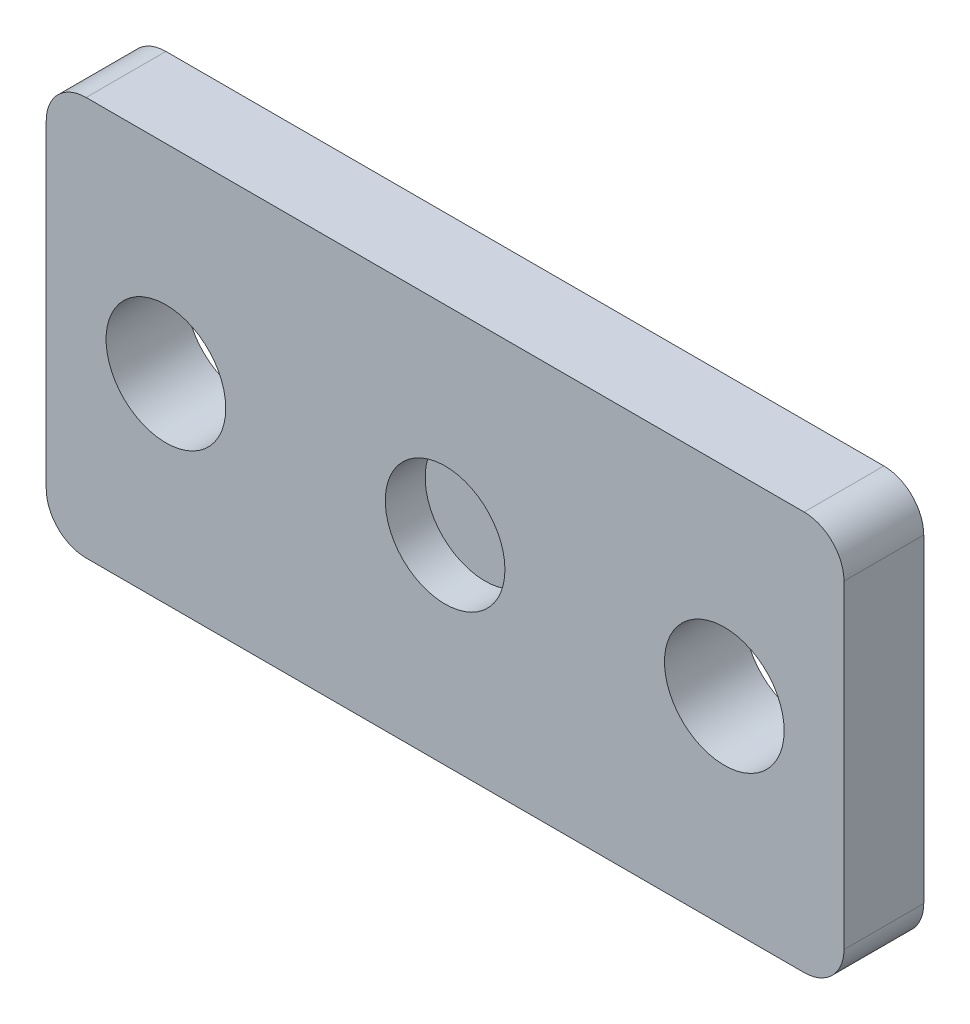
ISO-10303-21;
HEADER;
FILE_DESCRIPTION(('STEP AP214'),'2;1');
FILE_NAME('part.step','',(''),(''),'','','');
FILE_SCHEMA(('AUTOMOTIVE_DESIGN { 1 0 10303 214 1 1 1 1 }'));
ENDSEC;
DATA;
#1=APPLICATION_CONTEXT('core data for automotive mechanical design processes');
#2=APPLICATION_PROTOCOL_DEFINITION('international standard','automotive_design',2000,#1);
#3=PRODUCT_CONTEXT('',#1,'mechanical');
#4=PRODUCT('Part','Part','',(#3));
#5=PRODUCT_RELATED_PRODUCT_CATEGORY('part','',(#4));
#6=PRODUCT_DEFINITION_FORMATION('','',#4);
#7=PRODUCT_DEFINITION_CONTEXT('part definition',#1,'design');
#8=PRODUCT_DEFINITION('design','',#6,#7);
#9=PRODUCT_DEFINITION_SHAPE('','',#8);
#10=(LENGTH_UNIT() NAMED_UNIT(*) SI_UNIT(.MILLI.,.METRE.));
#11=(NAMED_UNIT(*) PLANE_ANGLE_UNIT() SI_UNIT($,.RADIAN.));
#12=(NAMED_UNIT(*) SI_UNIT($,.STERADIAN.) SOLID_ANGLE_UNIT());
#13=UNCERTAINTY_MEASURE_WITH_UNIT(LENGTH_MEASURE(1.E-05),#10,'distance_accuracy_value','');
#14=(GEOMETRIC_REPRESENTATION_CONTEXT(3) GLOBAL_UNCERTAINTY_ASSIGNED_CONTEXT((#13)) GLOBAL_UNIT_ASSIGNED_CONTEXT((#10,
#11,#12)) REPRESENTATION_CONTEXT('',''));
#15=CARTESIAN_POINT('',(0.,0.,0.));
#16=DIRECTION('',(0.,0.,1.));
#17=DIRECTION('',(1.,0.,0.));
#18=AXIS2_PLACEMENT_3D('',#15,#16,#17);
#19=CARTESIAN_POINT('',(0.,0.,0.));
#20=DIRECTION('',(0.,0.,-1.));
#21=DIRECTION('',(-1.,0.,0.));
#22=AXIS2_PLACEMENT_3D('',#19,#20,#21);
#23=PLANE('',#22);
#24=DIRECTION('',(1.,0.,0.));
#25=VECTOR('',#24,1.);
#26=CARTESIAN_POINT('',(-5000.,-2500.,0.));
#27=LINE('',#26,#25);
#28=CARTESIAN_POINT('',(-4500.,-2500.,0.));
#29=VERTEX_POINT('',#28);
#30=CARTESIAN_POINT('',(4500.,-2500.,0.));
#31=VERTEX_POINT('',#30);
#32=EDGE_CURVE('E197',#29,#31,#27,.T.);
#33=ORIENTED_EDGE('',*,*,#32,.F.);
#34=CARTESIAN_POINT('',(-4500.,-2000.,0.));
#35=DIRECTION('',(0.,0.,-1.));
#36=DIRECTION('',(-1.,0.,0.));
#37=AXIS2_PLACEMENT_3D('',#34,#35,#36);
#38=CIRCLE('',#37,500.);
#39=CARTESIAN_POINT('',(-5000.,-2000.,0.));
#40=VERTEX_POINT('',#39);
#41=EDGE_CURVE('E234',#29,#40,#38,.T.);
#42=ORIENTED_EDGE('',*,*,#41,.T.);
#43=DIRECTION('',(0.,-1.,0.));
#44=VECTOR('',#43,1.);
#45=CARTESIAN_POINT('',(-5000.,-2500.,0.));
#46=LINE('',#45,#44);
#47=CARTESIAN_POINT('',(-5000.,2000.,0.));
#48=VERTEX_POINT('',#47);
#49=EDGE_CURVE('E210',#48,#40,#46,.T.);
#50=ORIENTED_EDGE('',*,*,#49,.F.);
#51=CARTESIAN_POINT('',(-4500.,2000.,0.));
#52=DIRECTION('',(0.,0.,-1.));
#53=DIRECTION('',(-1.,0.,0.));
#54=AXIS2_PLACEMENT_3D('',#51,#52,#53);
#55=CIRCLE('',#54,500.);
#56=CARTESIAN_POINT('',(-4500.,2500.,0.));
#57=VERTEX_POINT('',#56);
#58=EDGE_CURVE('E217',#48,#57,#55,.T.);
#59=ORIENTED_EDGE('',*,*,#58,.T.);
#60=DIRECTION('',(-1.,0.,0.));
#61=VECTOR('',#60,1.);
#62=CARTESIAN_POINT('',(-5000.,2500.,0.));
#63=LINE('',#62,#61);
#64=CARTESIAN_POINT('',(4500.,2500.,0.));
#65=VERTEX_POINT('',#64);
#66=EDGE_CURVE('E208',#65,#57,#63,.T.);
#67=ORIENTED_EDGE('',*,*,#66,.F.);
#68=CARTESIAN_POINT('',(4500.,2000.,0.));
#69=DIRECTION('',(0.,0.,-1.));
#70=DIRECTION('',(-1.,0.,0.));
#71=AXIS2_PLACEMENT_3D('',#68,#69,#70);
#72=CIRCLE('',#71,500.);
#73=CARTESIAN_POINT('',(5000.,2000.,0.));
#74=VERTEX_POINT('',#73);
#75=EDGE_CURVE('E230',#65,#74,#72,.T.);
#76=ORIENTED_EDGE('',*,*,#75,.T.);
#77=DIRECTION('',(0.,1.,0.));
#78=VECTOR('',#77,1.);
#79=CARTESIAN_POINT('',(5000.,-2500.,0.));
#80=LINE('',#79,#78);
#81=CARTESIAN_POINT('',(5000.,-2000.,0.));
#82=VERTEX_POINT('',#81);
#83=EDGE_CURVE('E190',#82,#74,#80,.T.);
#84=ORIENTED_EDGE('',*,*,#83,.F.);
#85=CARTESIAN_POINT('',(4500.,-2000.,0.));
#86=DIRECTION('',(0.,0.,-1.));
#87=DIRECTION('',(-1.,0.,0.));
#88=AXIS2_PLACEMENT_3D('',#85,#86,#87);
#89=CIRCLE('',#88,500.);
#90=EDGE_CURVE('E232',#82,#31,#89,.T.);
#91=ORIENTED_EDGE('',*,*,#90,.T.);
#92=EDGE_LOOP('',(#33,#42,#50,#59,#67,#76,#84,#91));
#93=FACE_BOUND('',#92,.T.);
#94=CARTESIAN_POINT('',(-3500.,0.,0.));
#95=DIRECTION('',(0.,0.,1.));
#96=DIRECTION('',(1.,0.,0.));
#97=AXIS2_PLACEMENT_3D('',#94,#95,#96);
#98=CIRCLE('',#97,750.);
#99=CARTESIAN_POINT('',(-2750.,0.,0.));
#100=VERTEX_POINT('',#99);
#101=EDGE_CURVE('E187',#100,#100,#98,.T.);
#102=ORIENTED_EDGE('',*,*,#101,.T.);
#103=EDGE_LOOP('',(#102));
#104=FACE_BOUND('',#103,.T.);
#105=CARTESIAN_POINT('',(3500.,0.,0.));
#106=DIRECTION('',(0.,0.,1.));
#107=DIRECTION('',(1.,0.,0.));
#108=AXIS2_PLACEMENT_3D('',#105,#106,#107);
#109=CIRCLE('',#108,750.);
#110=CARTESIAN_POINT('',(4250.,0.,0.));
#111=VERTEX_POINT('',#110);
#112=EDGE_CURVE('E181',#111,#111,#109,.T.);
#113=ORIENTED_EDGE('',*,*,#112,.T.);
#114=EDGE_LOOP('',(#113));
#115=FACE_BOUND('',#114,.T.);
#116=DIRECTION('',(1.,0.,0.));
#117=VECTOR('',#116,1.);
#118=CARTESIAN_POINT('',(1000.,1000.,0.));
#119=LINE('',#118,#117);
#120=CARTESIAN_POINT('',(-1000.,1000.,0.));
#121=VERTEX_POINT('',#120);
#122=CARTESIAN_POINT('',(750.,1000.,0.));
#123=VERTEX_POINT('',#122);
#124=EDGE_CURVE('E154',#121,#123,#119,.T.);
#125=ORIENTED_EDGE('',*,*,#124,.F.);
#126=DIRECTION('',(0.,1.,0.));
#127=VECTOR('',#126,1.);
#128=CARTESIAN_POINT('',(-1000.,-1000.,0.));
#129=LINE('',#128,#127);
#130=CARTESIAN_POINT('',(-1000.,-750.,0.));
#131=VERTEX_POINT('',#130);
#132=EDGE_CURVE('E162',#131,#121,#129,.T.);
#133=ORIENTED_EDGE('',*,*,#132,.F.);
#134=CARTESIAN_POINT('',(-750.,-750.,0.));
#135=DIRECTION('',(0.,0.,-1.));
#136=DIRECTION('',(-1.,0.,0.));
#137=AXIS2_PLACEMENT_3D('',#134,#135,#136);
#138=CIRCLE('',#137,250.);
#139=CARTESIAN_POINT('',(-750.,-1000.,0.));
#140=VERTEX_POINT('',#139);
#141=EDGE_CURVE('E41',#131,#140,#138,.F.);
#142=ORIENTED_EDGE('',*,*,#141,.T.);
#143=DIRECTION('',(-1.,0.,0.));
#144=VECTOR('',#143,1.);
#145=CARTESIAN_POINT('',(1000.,-1000.,0.));
#146=LINE('',#145,#144);
#147=CARTESIAN_POINT('',(750.,-1000.,0.));
#148=VERTEX_POINT('',#147);
#149=EDGE_CURVE('E159',#148,#140,#146,.T.);
#150=ORIENTED_EDGE('',*,*,#149,.F.);
#151=CARTESIAN_POINT('',(750.,-750.,0.));
#152=DIRECTION('',(0.,0.,-1.));
#153=DIRECTION('',(-1.,0.,0.));
#154=AXIS2_PLACEMENT_3D('',#151,#152,#153);
#155=CIRCLE('',#154,250.);
#156=CARTESIAN_POINT('',(1000.,-750.,0.));
#157=VERTEX_POINT('',#156);
#158=EDGE_CURVE('E279',#148,#157,#155,.F.);
#159=ORIENTED_EDGE('',*,*,#158,.T.);
#160=DIRECTION('',(0.,-1.,0.));
#161=VECTOR('',#160,1.);
#162=CARTESIAN_POINT('',(1000.,-1000.,0.));
#163=LINE('',#162,#161);
#164=CARTESIAN_POINT('',(1000.,750.,0.));
#165=VERTEX_POINT('',#164);
#166=EDGE_CURVE('E168',#165,#157,#163,.T.);
#167=ORIENTED_EDGE('',*,*,#166,.F.);
#168=CARTESIAN_POINT('',(750.,750.,0.));
#169=DIRECTION('',(0.,0.,-1.));
#170=DIRECTION('',(-1.,0.,0.));
#171=AXIS2_PLACEMENT_3D('',#168,#169,#170);
#172=CIRCLE('',#171,250.);
#173=EDGE_CURVE('E11',#165,#123,#172,.F.);
#174=ORIENTED_EDGE('',*,*,#173,.T.);
#175=EDGE_LOOP('',(#125,#133,#142,#150,#159,#167,#174));
#176=FACE_BOUND('',#175,.T.);
#177=ADVANCED_FACE('F32',(#93,#104,#115,#176),#23,.T.);
#178=CARTESIAN_POINT('',(5000.,-2500.,1000.));
#179=DIRECTION('',(-1.,0.,0.));
#180=DIRECTION('',(0.,0.,1.));
#181=AXIS2_PLACEMENT_3D('',#178,#179,#180);
#182=PLANE('',#181);
#183=DIRECTION('',(0.,1.,0.));
#184=VECTOR('',#183,1.);
#185=CARTESIAN_POINT('',(5000.,-2500.,1000.));
#186=LINE('',#185,#184);
#187=CARTESIAN_POINT('',(5000.,-2000.,1000.));
#188=VERTEX_POINT('',#187);
#189=CARTESIAN_POINT('',(5000.,2000.,1000.));
#190=VERTEX_POINT('',#189);
#191=EDGE_CURVE('E193',#188,#190,#186,.T.);
#192=ORIENTED_EDGE('',*,*,#191,.F.);
#193=DIRECTION('',(0.,0.,-1.));
#194=VECTOR('',#193,1.);
#195=CARTESIAN_POINT('',(5000.,-2000.,1000.));
#196=LINE('',#195,#194);
#197=EDGE_CURVE('E246',#188,#82,#196,.T.);
#198=ORIENTED_EDGE('',*,*,#197,.T.);
#199=ORIENTED_EDGE('',*,*,#83,.T.);
#200=DIRECTION('',(0.,0.,-1.));
#201=VECTOR('',#200,1.);
#202=CARTESIAN_POINT('',(5000.,2000.,1000.));
#203=LINE('',#202,#201);
#204=EDGE_CURVE('E244',#74,#190,#203,.F.);
#205=ORIENTED_EDGE('',*,*,#204,.T.);
#206=EDGE_LOOP('',(#192,#198,#199,#205));
#207=FACE_BOUND('',#206,.T.);
#208=ADVANCED_FACE('F362',(#207),#182,.F.);
#209=CARTESIAN_POINT('',(-5000.,2500.,1000.));
#210=DIRECTION('',(0.,-1.,0.));
#211=DIRECTION('',(0.,0.,-1.));
#212=AXIS2_PLACEMENT_3D('',#209,#210,#211);
#213=PLANE('',#212);
#214=DIRECTION('',(-1.,0.,0.));
#215=VECTOR('',#214,1.);
#216=CARTESIAN_POINT('',(-5000.,2500.,1000.));
#217=LINE('',#216,#215);
#218=CARTESIAN_POINT('',(4500.,2500.,1000.));
#219=VERTEX_POINT('',#218);
#220=CARTESIAN_POINT('',(-4500.,2500.,1000.));
#221=VERTEX_POINT('',#220);
#222=EDGE_CURVE('E196',#219,#221,#217,.T.);
#223=ORIENTED_EDGE('',*,*,#222,.F.);
#224=DIRECTION('',(0.,0.,-1.));
#225=VECTOR('',#224,1.);
#226=CARTESIAN_POINT('',(4500.,2500.,1000.));
#227=LINE('',#226,#225);
#228=EDGE_CURVE('E249',#219,#65,#227,.T.);
#229=ORIENTED_EDGE('',*,*,#228,.T.);
#230=ORIENTED_EDGE('',*,*,#66,.T.);
#231=DIRECTION('',(0.,0.,-1.));
#232=VECTOR('',#231,1.);
#233=CARTESIAN_POINT('',(-4500.,2500.,1000.));
#234=LINE('',#233,#232);
#235=EDGE_CURVE('E220',#57,#221,#234,.F.);
#236=ORIENTED_EDGE('',*,*,#235,.T.);
#237=EDGE_LOOP('',(#223,#229,#230,#236));
#238=FACE_BOUND('',#237,.T.);
#239=ADVANCED_FACE('F368',(#238),#213,.F.);
#240=CARTESIAN_POINT('',(-5000.,-2500.,1000.));
#241=DIRECTION('',(1.,0.,0.));
#242=DIRECTION('',(0.,0.,-1.));
#243=AXIS2_PLACEMENT_3D('',#240,#241,#242);
#244=PLANE('',#243);
#245=ORIENTED_EDGE('',*,*,#49,.T.);
#246=DIRECTION('',(0.,0.,-1.));
#247=VECTOR('',#246,1.);
#248=CARTESIAN_POINT('',(-5000.,-2000.,1000.));
#249=LINE('',#248,#247);
#250=CARTESIAN_POINT('',(-5000.,-2000.,1000.));
#251=VERTEX_POINT('',#250);
#252=EDGE_CURVE('E236',#40,#251,#249,.F.);
#253=ORIENTED_EDGE('',*,*,#252,.T.);
#254=DIRECTION('',(0.,-1.,0.));
#255=VECTOR('',#254,1.);
#256=CARTESIAN_POINT('',(-5000.,-2500.,1000.));
#257=LINE('',#256,#255);
#258=CARTESIAN_POINT('',(-5000.,2000.,1000.));
#259=VERTEX_POINT('',#258);
#260=EDGE_CURVE('E199',#259,#251,#257,.T.);
#261=ORIENTED_EDGE('',*,*,#260,.F.);
#262=DIRECTION('',(0.,0.,-1.));
#263=VECTOR('',#262,1.);
#264=CARTESIAN_POINT('',(-5000.,2000.,1000.));
#265=LINE('',#264,#263);
#266=EDGE_CURVE('E205',#259,#48,#265,.T.);
#267=ORIENTED_EDGE('',*,*,#266,.T.);
#268=EDGE_LOOP('',(#245,#253,#261,#267));
#269=FACE_BOUND('',#268,.T.);
#270=ADVANCED_FACE('F380',(#269),#244,.F.);
#271=CARTESIAN_POINT('',(-5000.,-2500.,1000.));
#272=DIRECTION('',(0.,1.,0.));
#273=DIRECTION('',(0.,0.,1.));
#274=AXIS2_PLACEMENT_3D('',#271,#272,#273);
#275=PLANE('',#274);
#276=DIRECTION('',(1.,0.,0.));
#277=VECTOR('',#276,1.);
#278=CARTESIAN_POINT('',(-5000.,-2500.,1000.));
#279=LINE('',#278,#277);
#280=CARTESIAN_POINT('',(-4500.,-2500.,1000.));
#281=VERTEX_POINT('',#280);
#282=CARTESIAN_POINT('',(4500.,-2500.,1000.));
#283=VERTEX_POINT('',#282);
#284=EDGE_CURVE('E202',#281,#283,#279,.T.);
#285=ORIENTED_EDGE('',*,*,#284,.F.);
#286=DIRECTION('',(0.,0.,-1.));
#287=VECTOR('',#286,1.);
#288=CARTESIAN_POINT('',(-4500.,-2500.,1000.));
#289=LINE('',#288,#287);
#290=EDGE_CURVE('E227',#281,#29,#289,.T.);
#291=ORIENTED_EDGE('',*,*,#290,.T.);
#292=ORIENTED_EDGE('',*,*,#32,.T.);
#293=DIRECTION('',(0.,0.,-1.));
#294=VECTOR('',#293,1.);
#295=CARTESIAN_POINT('',(4500.,-2500.,1000.));
#296=LINE('',#295,#294);
#297=EDGE_CURVE('E225',#31,#283,#296,.F.);
#298=ORIENTED_EDGE('',*,*,#297,.T.);
#299=EDGE_LOOP('',(#285,#291,#292,#298));
#300=FACE_BOUND('',#299,.T.);
#301=ADVANCED_FACE('F377',(#300),#275,.F.);
#302=CARTESIAN_POINT('',(0.,0.,1000.));
#303=DIRECTION('',(0.,0.,-1.));
#304=DIRECTION('',(-1.,0.,0.));
#305=AXIS2_PLACEMENT_3D('',#302,#303,#304);
#306=PLANE('',#305);
#307=CARTESIAN_POINT('',(0.,0.,1000.));
#308=DIRECTION('',(0.,0.,1.));
#309=DIRECTION('',(1.,0.,0.));
#310=AXIS2_PLACEMENT_3D('',#307,#308,#309);
#311=CIRCLE('',#310,750.);
#312=CARTESIAN_POINT('',(750.,0.,1000.));
#313=VERTEX_POINT('',#312);
#314=EDGE_CURVE('E158',#313,#313,#311,.T.);
#315=ORIENTED_EDGE('',*,*,#314,.F.);
#316=EDGE_LOOP('',(#315));
#317=FACE_BOUND('',#316,.T.);
#318=CARTESIAN_POINT('',(3500.,0.,1000.));
#319=DIRECTION('',(0.,0.,1.));
#320=DIRECTION('',(1.,0.,0.));
#321=AXIS2_PLACEMENT_3D('',#318,#319,#320);
#322=CIRCLE('',#321,750.);
#323=CARTESIAN_POINT('',(4250.,0.,1000.));
#324=VERTEX_POINT('',#323);
#325=EDGE_CURVE('E178',#324,#324,#322,.T.);
#326=ORIENTED_EDGE('',*,*,#325,.F.);
#327=EDGE_LOOP('',(#326));
#328=FACE_BOUND('',#327,.T.);
#329=CARTESIAN_POINT('',(-3500.,0.,1000.));
#330=DIRECTION('',(0.,0.,1.));
#331=DIRECTION('',(1.,0.,0.));
#332=AXIS2_PLACEMENT_3D('',#329,#330,#331);
#333=CIRCLE('',#332,750.);
#334=CARTESIAN_POINT('',(-2750.,0.,1000.));
#335=VERTEX_POINT('',#334);
#336=EDGE_CURVE('E184',#335,#335,#333,.T.);
#337=ORIENTED_EDGE('',*,*,#336,.F.);
#338=EDGE_LOOP('',(#337));
#339=FACE_BOUND('',#338,.T.);
#340=ORIENTED_EDGE('',*,*,#260,.T.);
#341=CARTESIAN_POINT('',(-4500.,-2000.,1000.));
#342=DIRECTION('',(0.,0.,-1.));
#343=DIRECTION('',(-1.,0.,0.));
#344=AXIS2_PLACEMENT_3D('',#341,#342,#343);
#345=CIRCLE('',#344,500.);
#346=EDGE_CURVE('E242',#251,#281,#345,.F.);
#347=ORIENTED_EDGE('',*,*,#346,.T.);
#348=ORIENTED_EDGE('',*,*,#284,.T.);
#349=CARTESIAN_POINT('',(4500.,-2000.,1000.));
#350=DIRECTION('',(0.,0.,-1.));
#351=DIRECTION('',(-1.,0.,0.));
#352=AXIS2_PLACEMENT_3D('',#349,#350,#351);
#353=CIRCLE('',#352,500.);
#354=EDGE_CURVE('E240',#283,#188,#353,.F.);
#355=ORIENTED_EDGE('',*,*,#354,.T.);
#356=ORIENTED_EDGE('',*,*,#191,.T.);
#357=CARTESIAN_POINT('',(4500.,2000.,1000.));
#358=DIRECTION('',(0.,0.,-1.));
#359=DIRECTION('',(-1.,0.,0.));
#360=AXIS2_PLACEMENT_3D('',#357,#358,#359);
#361=CIRCLE('',#360,500.);
#362=EDGE_CURVE('E238',#190,#219,#361,.F.);
#363=ORIENTED_EDGE('',*,*,#362,.T.);
#364=ORIENTED_EDGE('',*,*,#222,.T.);
#365=CARTESIAN_POINT('',(-4500.,2000.,1000.));
#366=DIRECTION('',(0.,0.,-1.));
#367=DIRECTION('',(-1.,0.,0.));
#368=AXIS2_PLACEMENT_3D('',#365,#366,#367);
#369=CIRCLE('',#368,500.);
#370=EDGE_CURVE('E223',#221,#259,#369,.F.);
#371=ORIENTED_EDGE('',*,*,#370,.T.);
#372=EDGE_LOOP('',(#340,#347,#348,#355,#356,#363,#364,#371));
#373=FACE_BOUND('',#372,.T.);
#374=ADVANCED_FACE('F375',(#317,#328,#339,#373),#306,.F.);
#375=CARTESIAN_POINT('',(-4500.,2000.,1000.));
#376=DIRECTION('',(0.,0.,-1.));
#377=DIRECTION('',(-1.,0.,0.));
#378=AXIS2_PLACEMENT_3D('',#375,#376,#377);
#379=CYLINDRICAL_SURFACE('',#378,500.);
#380=ORIENTED_EDGE('',*,*,#370,.F.);
#381=ORIENTED_EDGE('',*,*,#235,.F.);
#382=ORIENTED_EDGE('',*,*,#58,.F.);
#383=ORIENTED_EDGE('',*,*,#266,.F.);
#384=EDGE_LOOP('',(#380,#381,#382,#383));
#385=FACE_BOUND('',#384,.T.);
#386=ADVANCED_FACE('F388',(#385),#379,.T.);
#387=CARTESIAN_POINT('',(-4500.,-2000.,1000.));
#388=DIRECTION('',(0.,0.,-1.));
#389=DIRECTION('',(-1.,0.,0.));
#390=AXIS2_PLACEMENT_3D('',#387,#388,#389);
#391=CYLINDRICAL_SURFACE('',#390,500.);
#392=ORIENTED_EDGE('',*,*,#346,.F.);
#393=ORIENTED_EDGE('',*,*,#252,.F.);
#394=ORIENTED_EDGE('',*,*,#41,.F.);
#395=ORIENTED_EDGE('',*,*,#290,.F.);
#396=EDGE_LOOP('',(#392,#393,#394,#395));
#397=FACE_BOUND('',#396,.T.);
#398=ADVANCED_FACE('F391',(#397),#391,.T.);
#399=CARTESIAN_POINT('',(4500.,-2000.,1000.));
#400=DIRECTION('',(0.,0.,-1.));
#401=DIRECTION('',(-1.,0.,0.));
#402=AXIS2_PLACEMENT_3D('',#399,#400,#401);
#403=CYLINDRICAL_SURFACE('',#402,500.);
#404=ORIENTED_EDGE('',*,*,#354,.F.);
#405=ORIENTED_EDGE('',*,*,#297,.F.);
#406=ORIENTED_EDGE('',*,*,#90,.F.);
#407=ORIENTED_EDGE('',*,*,#197,.F.);
#408=EDGE_LOOP('',(#404,#405,#406,#407));
#409=FACE_BOUND('',#408,.T.);
#410=ADVANCED_FACE('F395',(#409),#403,.T.);
#411=CARTESIAN_POINT('',(4500.,2000.,1000.));
#412=DIRECTION('',(0.,0.,-1.));
#413=DIRECTION('',(-1.,0.,0.));
#414=AXIS2_PLACEMENT_3D('',#411,#412,#413);
#415=CYLINDRICAL_SURFACE('',#414,500.);
#416=ORIENTED_EDGE('',*,*,#362,.F.);
#417=ORIENTED_EDGE('',*,*,#204,.F.);
#418=ORIENTED_EDGE('',*,*,#75,.F.);
#419=ORIENTED_EDGE('',*,*,#228,.F.);
#420=EDGE_LOOP('',(#416,#417,#418,#419));
#421=FACE_BOUND('',#420,.T.);
#422=ADVANCED_FACE('F399',(#421),#415,.T.);
#423=CARTESIAN_POINT('',(-3500.,0.,0.));
#424=DIRECTION('',(0.,0.,1.));
#425=DIRECTION('',(1.,0.,0.));
#426=AXIS2_PLACEMENT_3D('',#423,#424,#425);
#427=CYLINDRICAL_SURFACE('',#426,750.);
#428=ORIENTED_EDGE('',*,*,#101,.F.);
#429=EDGE_LOOP('',(#428));
#430=FACE_BOUND('',#429,.T.);
#431=ORIENTED_EDGE('',*,*,#336,.T.);
#432=EDGE_LOOP('',(#431));
#433=FACE_BOUND('',#432,.T.);
#434=ADVANCED_FACE('F402',(#430,#433),#427,.F.);
#435=CARTESIAN_POINT('',(3500.,0.,0.));
#436=DIRECTION('',(0.,0.,1.));
#437=DIRECTION('',(1.,0.,0.));
#438=AXIS2_PLACEMENT_3D('',#435,#436,#437);
#439=CYLINDRICAL_SURFACE('',#438,750.);
#440=ORIENTED_EDGE('',*,*,#112,.F.);
#441=EDGE_LOOP('',(#440));
#442=FACE_BOUND('',#441,.T.);
#443=ORIENTED_EDGE('',*,*,#325,.T.);
#444=EDGE_LOOP('',(#443));
#445=FACE_BOUND('',#444,.T.);
#446=ADVANCED_FACE('F407',(#442,#445),#439,.F.);
#447=CARTESIAN_POINT('',(0.,0.,500.));
#448=DIRECTION('',(0.,0.,1.));
#449=DIRECTION('',(1.,0.,0.));
#450=AXIS2_PLACEMENT_3D('',#447,#448,#449);
#451=CYLINDRICAL_SURFACE('',#450,750.);
#452=CARTESIAN_POINT('',(0.,0.,500.));
#453=DIRECTION('',(0.,0.,1.));
#454=DIRECTION('',(1.,0.,0.));
#455=AXIS2_PLACEMENT_3D('',#452,#453,#454);
#456=CIRCLE('',#455,750.);
#457=CARTESIAN_POINT('',(750.,0.,500.));
#458=VERTEX_POINT('',#457);
#459=EDGE_CURVE('E175',#458,#458,#456,.T.);
#460=ORIENTED_EDGE('',*,*,#459,.F.);
#461=EDGE_LOOP('',(#460));
#462=FACE_BOUND('',#461,.T.);
#463=ORIENTED_EDGE('',*,*,#314,.T.);
#464=EDGE_LOOP('',(#463));
#465=FACE_BOUND('',#464,.T.);
#466=ADVANCED_FACE('F441',(#462,#465),#451,.F.);
#467=CARTESIAN_POINT('',(0.,0.,500.));
#468=DIRECTION('',(0.,0.,1.));
#469=DIRECTION('',(1.,0.,0.));
#470=AXIS2_PLACEMENT_3D('',#467,#468,#469);
#471=PLANE('',#470);
#472=ORIENTED_EDGE('',*,*,#459,.T.);
#473=EDGE_LOOP('',(#472));
#474=FACE_BOUND('',#473,.T.);
#475=ADVANCED_FACE('F447',(#474),#471,.T.);
#476=CARTESIAN_POINT('',(-1000.,-1000.,-500.));
#477=DIRECTION('',(1.,0.,0.));
#478=DIRECTION('',(0.,1.,0.));
#479=AXIS2_PLACEMENT_3D('',#476,#477,#478);
#480=PLANE('',#479);
#481=DIRECTION('',(0.,1.,0.));
#482=VECTOR('',#481,1.);
#483=CARTESIAN_POINT('',(-1000.,-1000.,-250.));
#484=LINE('',#483,#482);
#485=CARTESIAN_POINT('',(-1000.,1000.,-250.));
#486=VERTEX_POINT('',#485);
#487=CARTESIAN_POINT('',(-1000.,-750.,-250.));
#488=VERTEX_POINT('',#487);
#489=EDGE_CURVE('E274',#486,#488,#484,.F.);
#490=ORIENTED_EDGE('',*,*,#489,.T.);
#491=DIRECTION('',(0.,0.,1.));
#492=VECTOR('',#491,1.);
#493=CARTESIAN_POINT('',(-1000.,-750.,-500.));
#494=LINE('',#493,#492);
#495=EDGE_CURVE('E165',#488,#131,#494,.T.);
#496=ORIENTED_EDGE('',*,*,#495,.T.);
#497=ORIENTED_EDGE('',*,*,#132,.T.);
#498=DIRECTION('',(0.,0.,1.));
#499=VECTOR('',#498,1.);
#500=CARTESIAN_POINT('',(-1000.,1000.,-500.));
#501=LINE('',#500,#499);
#502=EDGE_CURVE('E151',#486,#121,#501,.T.);
#503=ORIENTED_EDGE('',*,*,#502,.F.);
#504=EDGE_LOOP('',(#490,#496,#497,#503));
#505=FACE_BOUND('',#504,.T.);
#506=ADVANCED_FACE('F163',(#505),#480,.F.);
#507=CARTESIAN_POINT('',(1000.,1000.,-500.));
#508=DIRECTION('',(0.,-1.,0.));
#509=DIRECTION('',(0.,0.,-1.));
#510=AXIS2_PLACEMENT_3D('',#507,#508,#509);
#511=PLANE('',#510);
#512=DIRECTION('',(0.,0.,1.));
#513=VECTOR('',#512,1.);
#514=CARTESIAN_POINT('',(750.,1000.,-500.));
#515=LINE('',#514,#513);
#516=CARTESIAN_POINT('',(750.,1000.,-250.));
#517=VERTEX_POINT('',#516);
#518=EDGE_CURVE('E49',#123,#517,#515,.F.);
#519=ORIENTED_EDGE('',*,*,#518,.T.);
#520=DIRECTION('',(1.,0.,0.));
#521=VECTOR('',#520,1.);
#522=CARTESIAN_POINT('',(1000.,1000.,-250.));
#523=LINE('',#522,#521);
#524=EDGE_CURVE('E155',#517,#486,#523,.F.);
#525=ORIENTED_EDGE('',*,*,#524,.T.);
#526=ORIENTED_EDGE('',*,*,#502,.T.);
#527=ORIENTED_EDGE('',*,*,#124,.T.);
#528=EDGE_LOOP('',(#519,#525,#526,#527));
#529=FACE_BOUND('',#528,.T.);
#530=ADVANCED_FACE('F153',(#529),#511,.F.);
#531=CARTESIAN_POINT('',(1000.,-1000.,-500.));
#532=DIRECTION('',(-1.,0.,0.));
#533=DIRECTION('',(0.,0.,1.));
#534=AXIS2_PLACEMENT_3D('',#531,#532,#533);
#535=PLANE('',#534);
#536=ORIENTED_EDGE('',*,*,#166,.T.);
#537=DIRECTION('',(0.,0.,1.));
#538=VECTOR('',#537,1.);
#539=CARTESIAN_POINT('',(1000.,-750.,-500.));
#540=LINE('',#539,#538);
#541=CARTESIAN_POINT('',(1000.,-750.,-250.));
#542=VERTEX_POINT('',#541);
#543=EDGE_CURVE('E263',#157,#542,#540,.F.);
#544=ORIENTED_EDGE('',*,*,#543,.T.);
#545=DIRECTION('',(0.,-1.,0.));
#546=VECTOR('',#545,1.);
#547=CARTESIAN_POINT('',(1000.,-1000.,-250.));
#548=LINE('',#547,#546);
#549=CARTESIAN_POINT('',(1000.,750.,-250.));
#550=VERTEX_POINT('',#549);
#551=EDGE_CURVE('E261',#542,#550,#548,.F.);
#552=ORIENTED_EDGE('',*,*,#551,.T.);
#553=DIRECTION('',(0.,0.,1.));
#554=VECTOR('',#553,1.);
#555=CARTESIAN_POINT('',(1000.,750.,-500.));
#556=LINE('',#555,#554);
#557=EDGE_CURVE('E259',#550,#165,#556,.T.);
#558=ORIENTED_EDGE('',*,*,#557,.T.);
#559=EDGE_LOOP('',(#536,#544,#552,#558));
#560=FACE_BOUND('',#559,.T.);
#561=ADVANCED_FACE('F343',(#560),#535,.F.);
#562=CARTESIAN_POINT('',(1000.,-1000.,-500.));
#563=DIRECTION('',(0.,1.,0.));
#564=DIRECTION('',(0.,0.,1.));
#565=AXIS2_PLACEMENT_3D('',#562,#563,#564);
#566=PLANE('',#565);
#567=DIRECTION('',(-1.,0.,0.));
#568=VECTOR('',#567,1.);
#569=CARTESIAN_POINT('',(1000.,-1000.,-250.));
#570=LINE('',#569,#568);
#571=CARTESIAN_POINT('',(-750.,-1000.,-250.));
#572=VERTEX_POINT('',#571);
#573=CARTESIAN_POINT('',(750.,-1000.,-250.));
#574=VERTEX_POINT('',#573);
#575=EDGE_CURVE('E252',#572,#574,#570,.F.);
#576=ORIENTED_EDGE('',*,*,#575,.T.);
#577=DIRECTION('',(0.,0.,1.));
#578=VECTOR('',#577,1.);
#579=CARTESIAN_POINT('',(750.,-1000.,-500.));
#580=LINE('',#579,#578);
#581=EDGE_CURVE('E256',#574,#148,#580,.T.);
#582=ORIENTED_EDGE('',*,*,#581,.T.);
#583=ORIENTED_EDGE('',*,*,#149,.T.);
#584=DIRECTION('',(0.,0.,1.));
#585=VECTOR('',#584,1.);
#586=CARTESIAN_POINT('',(-750.,-1000.,-500.));
#587=LINE('',#586,#585);
#588=EDGE_CURVE('E254',#140,#572,#587,.F.);
#589=ORIENTED_EDGE('',*,*,#588,.T.);
#590=EDGE_LOOP('',(#576,#582,#583,#589));
#591=FACE_BOUND('',#590,.T.);
#592=ADVANCED_FACE('F337',(#591),#566,.F.);
#593=CARTESIAN_POINT('',(0.,0.,-500.));
#594=DIRECTION('',(0.,0.,1.));
#595=DIRECTION('',(1.,0.,0.));
#596=AXIS2_PLACEMENT_3D('',#593,#594,#595);
#597=PLANE('',#596);
#598=DIRECTION('',(1.,0.,0.));
#599=VECTOR('',#598,1.);
#600=CARTESIAN_POINT('',(0.,750.,-500.));
#601=LINE('',#600,#599);
#602=CARTESIAN_POINT('',(-750.,750.,-500.));
#603=VERTEX_POINT('',#602);
#604=CARTESIAN_POINT('',(750.,750.,-500.));
#605=VERTEX_POINT('',#604);
#606=EDGE_CURVE('E265',#603,#605,#601,.T.);
#607=ORIENTED_EDGE('',*,*,#606,.T.);
#608=DIRECTION('',(0.,-1.,0.));
#609=VECTOR('',#608,1.);
#610=CARTESIAN_POINT('',(750.,0.,-500.));
#611=LINE('',#610,#609);
#612=CARTESIAN_POINT('',(750.,-750.,-500.));
#613=VERTEX_POINT('',#612);
#614=EDGE_CURVE('E271',#605,#613,#611,.T.);
#615=ORIENTED_EDGE('',*,*,#614,.T.);
#616=DIRECTION('',(-1.,0.,0.));
#617=VECTOR('',#616,1.);
#618=CARTESIAN_POINT('',(0.,-750.,-500.));
#619=LINE('',#618,#617);
#620=CARTESIAN_POINT('',(-750.,-750.,-500.));
#621=VERTEX_POINT('',#620);
#622=EDGE_CURVE('E269',#613,#621,#619,.T.);
#623=ORIENTED_EDGE('',*,*,#622,.T.);
#624=DIRECTION('',(0.,1.,0.));
#625=VECTOR('',#624,1.);
#626=CARTESIAN_POINT('',(-750.,0.,-500.));
#627=LINE('',#626,#625);
#628=EDGE_CURVE('E267',#621,#603,#627,.T.);
#629=ORIENTED_EDGE('',*,*,#628,.T.);
#630=EDGE_LOOP('',(#607,#615,#623,#629));
#631=FACE_BOUND('',#630,.T.);
#632=ADVANCED_FACE('F320',(#631),#597,.F.);
#633=CARTESIAN_POINT('',(750.,750.,-500.));
#634=DIRECTION('',(0.,0.,1.));
#635=DIRECTION('',(1.,0.,0.));
#636=AXIS2_PLACEMENT_3D('',#633,#634,#635);
#637=CYLINDRICAL_SURFACE('',#636,250.);
#638=ORIENTED_EDGE('',*,*,#173,.F.);
#639=ORIENTED_EDGE('',*,*,#557,.F.);
#640=CARTESIAN_POINT('',(750.,750.,-250.));
#641=DIRECTION('',(0.,0.,-1.));
#642=DIRECTION('',(-1.,0.,0.));
#643=AXIS2_PLACEMENT_3D('',#640,#641,#642);
#644=CIRCLE('',#643,250.);
#645=EDGE_CURVE('E304',#517,#550,#644,.T.);
#646=ORIENTED_EDGE('',*,*,#645,.F.);
#647=ORIENTED_EDGE('',*,*,#518,.F.);
#648=EDGE_LOOP('',(#638,#639,#646,#647));
#649=FACE_BOUND('',#648,.T.);
#650=ADVANCED_FACE('F34',(#649),#637,.T.);
#651=CARTESIAN_POINT('',(0.,750.,-250.));
#652=DIRECTION('',(1.,0.,0.));
#653=DIRECTION('',(0.,0.,-1.));
#654=AXIS2_PLACEMENT_3D('',#651,#652,#653);
#655=CYLINDRICAL_SURFACE('',#654,250.);
#656=CARTESIAN_POINT('',(750.,750.,-250.));
#657=DIRECTION('',(1.,0.,0.));
#658=DIRECTION('',(0.,0.,-1.));
#659=AXIS2_PLACEMENT_3D('',#656,#657,#658);
#660=CIRCLE('',#659,250.);
#661=EDGE_CURVE('E302',#605,#517,#660,.T.);
#662=ORIENTED_EDGE('',*,*,#661,.F.);
#663=ORIENTED_EDGE('',*,*,#606,.F.);
#664=CARTESIAN_POINT('',(-750.,750.,-250.));
#665=DIRECTION('',(0.707106781186547,0.707106781186548,0.));
#666=DIRECTION('',(0.707106781186547,-0.707106781186547,0.));
#667=AXIS2_PLACEMENT_3D('',#664,#665,#666);
#668=ELLIPSE('',#667,353.553390593274,250.);
#669=EDGE_CURVE('E36',#486,#603,#668,.F.);
#670=ORIENTED_EDGE('',*,*,#669,.F.);
#671=ORIENTED_EDGE('',*,*,#524,.F.);
#672=EDGE_LOOP('',(#662,#663,#670,#671));
#673=FACE_BOUND('',#672,.T.);
#674=ADVANCED_FACE('F318',(#673),#655,.T.);
#675=CARTESIAN_POINT('',(-750.,0.,-250.));
#676=DIRECTION('',(0.,1.,0.));
#677=DIRECTION('',(-1.,0.,0.));
#678=AXIS2_PLACEMENT_3D('',#675,#676,#677);
#679=CYLINDRICAL_SURFACE('',#678,250.);
#680=ORIENTED_EDGE('',*,*,#669,.T.);
#681=ORIENTED_EDGE('',*,*,#628,.F.);
#682=CARTESIAN_POINT('',(-750.,-750.,-250.));
#683=DIRECTION('',(0.,-1.,0.));
#684=DIRECTION('',(0.,0.,-1.));
#685=AXIS2_PLACEMENT_3D('',#682,#683,#684);
#686=CIRCLE('',#685,250.);
#687=EDGE_CURVE('E299',#488,#621,#686,.T.);
#688=ORIENTED_EDGE('',*,*,#687,.F.);
#689=ORIENTED_EDGE('',*,*,#489,.F.);
#690=EDGE_LOOP('',(#680,#681,#688,#689));
#691=FACE_BOUND('',#690,.T.);
#692=ADVANCED_FACE('F313',(#691),#679,.T.);
#693=CARTESIAN_POINT('',(-750.,-750.,-500.));
#694=DIRECTION('',(0.,0.,1.));
#695=DIRECTION('',(1.,0.,0.));
#696=AXIS2_PLACEMENT_3D('',#693,#694,#695);
#697=CYLINDRICAL_SURFACE('',#696,250.);
#698=ORIENTED_EDGE('',*,*,#141,.F.);
#699=ORIENTED_EDGE('',*,*,#495,.F.);
#700=CARTESIAN_POINT('',(-750.,-750.,-250.));
#701=DIRECTION('',(0.,0.,-1.));
#702=DIRECTION('',(-1.,0.,0.));
#703=AXIS2_PLACEMENT_3D('',#700,#701,#702);
#704=CIRCLE('',#703,250.);
#705=EDGE_CURVE('E296',#572,#488,#704,.T.);
#706=ORIENTED_EDGE('',*,*,#705,.F.);
#707=ORIENTED_EDGE('',*,*,#588,.F.);
#708=EDGE_LOOP('',(#698,#699,#706,#707));
#709=FACE_BOUND('',#708,.T.);
#710=ADVANCED_FACE('F334',(#709),#697,.T.);
#711=CARTESIAN_POINT('',(750.,750.,-250.));
#712=DIRECTION('',(0.,0.,1.));
#713=DIRECTION('',(1.,0.,0.));
#714=AXIS2_PLACEMENT_3D('',#711,#712,#713);
#715=SPHERICAL_SURFACE('',#714,250.);
#716=ORIENTED_EDGE('',*,*,#661,.T.);
#717=ORIENTED_EDGE('',*,*,#645,.T.);
#718=CARTESIAN_POINT('',(750.,750.,-250.));
#719=DIRECTION('',(0.,1.,0.));
#720=DIRECTION('',(0.,0.,1.));
#721=AXIS2_PLACEMENT_3D('',#718,#719,#720);
#722=CIRCLE('',#721,250.);
#723=EDGE_CURVE('E293',#605,#550,#722,.F.);
#724=ORIENTED_EDGE('',*,*,#723,.F.);
#725=EDGE_LOOP('',(#716,#717,#724));
#726=FACE_BOUND('',#725,.T.);
#727=ADVANCED_FACE('F347',(#726),#715,.T.);
#728=CARTESIAN_POINT('',(-750.,-750.,-250.));
#729=DIRECTION('',(0.,0.,1.));
#730=DIRECTION('',(1.,0.,0.));
#731=AXIS2_PLACEMENT_3D('',#728,#729,#730);
#732=SPHERICAL_SURFACE('',#731,250.);
#733=ORIENTED_EDGE('',*,*,#705,.T.);
#734=ORIENTED_EDGE('',*,*,#687,.T.);
#735=CARTESIAN_POINT('',(-750.,-750.,-250.));
#736=DIRECTION('',(-1.,0.,0.));
#737=DIRECTION('',(0.,0.,1.));
#738=AXIS2_PLACEMENT_3D('',#735,#736,#737);
#739=CIRCLE('',#738,250.);
#740=EDGE_CURVE('E290',#572,#621,#739,.F.);
#741=ORIENTED_EDGE('',*,*,#740,.F.);
#742=EDGE_LOOP('',(#733,#734,#741));
#743=FACE_BOUND('',#742,.T.);
#744=ADVANCED_FACE('F330',(#743),#732,.T.);
#745=CARTESIAN_POINT('',(750.,0.,-250.));
#746=DIRECTION('',(0.,-1.,0.));
#747=DIRECTION('',(0.,0.,-1.));
#748=AXIS2_PLACEMENT_3D('',#745,#746,#747);
#749=CYLINDRICAL_SURFACE('',#748,250.);
#750=ORIENTED_EDGE('',*,*,#723,.T.);
#751=ORIENTED_EDGE('',*,*,#551,.F.);
#752=CARTESIAN_POINT('',(750.,-750.,-250.));
#753=DIRECTION('',(0.,-1.,0.));
#754=DIRECTION('',(0.,0.,-1.));
#755=AXIS2_PLACEMENT_3D('',#752,#753,#754);
#756=CIRCLE('',#755,250.);
#757=EDGE_CURVE('E287',#613,#542,#756,.T.);
#758=ORIENTED_EDGE('',*,*,#757,.F.);
#759=ORIENTED_EDGE('',*,*,#614,.F.);
#760=EDGE_LOOP('',(#750,#751,#758,#759));
#761=FACE_BOUND('',#760,.T.);
#762=ADVANCED_FACE('F350',(#761),#749,.T.);
#763=CARTESIAN_POINT('',(0.,-750.,-250.));
#764=DIRECTION('',(-1.,0.,0.));
#765=DIRECTION('',(0.,0.,1.));
#766=AXIS2_PLACEMENT_3D('',#763,#764,#765);
#767=CYLINDRICAL_SURFACE('',#766,250.);
#768=ORIENTED_EDGE('',*,*,#740,.T.);
#769=ORIENTED_EDGE('',*,*,#622,.F.);
#770=CARTESIAN_POINT('',(750.,-750.,-250.));
#771=DIRECTION('',(1.,0.,0.));
#772=DIRECTION('',(0.,0.,-1.));
#773=AXIS2_PLACEMENT_3D('',#770,#771,#772);
#774=CIRCLE('',#773,250.);
#775=EDGE_CURVE('E285',#574,#613,#774,.T.);
#776=ORIENTED_EDGE('',*,*,#775,.F.);
#777=ORIENTED_EDGE('',*,*,#575,.F.);
#778=EDGE_LOOP('',(#768,#769,#776,#777));
#779=FACE_BOUND('',#778,.T.);
#780=ADVANCED_FACE('F325',(#779),#767,.T.);
#781=CARTESIAN_POINT('',(750.,-750.,-250.));
#782=DIRECTION('',(0.,0.,1.));
#783=DIRECTION('',(1.,0.,0.));
#784=AXIS2_PLACEMENT_3D('',#781,#782,#783);
#785=SPHERICAL_SURFACE('',#784,250.);
#786=ORIENTED_EDGE('',*,*,#775,.T.);
#787=ORIENTED_EDGE('',*,*,#757,.T.);
#788=CARTESIAN_POINT('',(750.,-750.,-250.));
#789=DIRECTION('',(0.,0.,-1.));
#790=DIRECTION('',(-1.,0.,0.));
#791=AXIS2_PLACEMENT_3D('',#788,#789,#790);
#792=CIRCLE('',#791,250.);
#793=EDGE_CURVE('E282',#574,#542,#792,.F.);
#794=ORIENTED_EDGE('',*,*,#793,.F.);
#795=EDGE_LOOP('',(#786,#787,#794));
#796=FACE_BOUND('',#795,.T.);
#797=ADVANCED_FACE('F352',(#796),#785,.T.);
#798=CARTESIAN_POINT('',(750.,-750.,-500.));
#799=DIRECTION('',(0.,0.,1.));
#800=DIRECTION('',(1.,0.,0.));
#801=AXIS2_PLACEMENT_3D('',#798,#799,#800);
#802=CYLINDRICAL_SURFACE('',#801,250.);
#803=ORIENTED_EDGE('',*,*,#793,.T.);
#804=ORIENTED_EDGE('',*,*,#543,.F.);
#805=ORIENTED_EDGE('',*,*,#158,.F.);
#806=ORIENTED_EDGE('',*,*,#581,.F.);
#807=EDGE_LOOP('',(#803,#804,#805,#806));
#808=FACE_BOUND('',#807,.T.);
#809=ADVANCED_FACE('F340',(#808),#802,.T.);
#810=CLOSED_SHELL('',(#177,#208,#239,#270,#301,#374,#386,#398,#410,#422,#434,#446,#466,#475,
#506,#530,#561,#592,#632,#650,#674,#692,#710,#727,#744,#762,#780,#797,#809));
#811=MANIFOLD_SOLID_BREP('B2',#810);
#812=ADVANCED_BREP_SHAPE_REPRESENTATION('',(#18,#811),#14);
#813=SHAPE_DEFINITION_REPRESENTATION(#9,#812);
ENDSEC;
END-ISO-10303-21;
